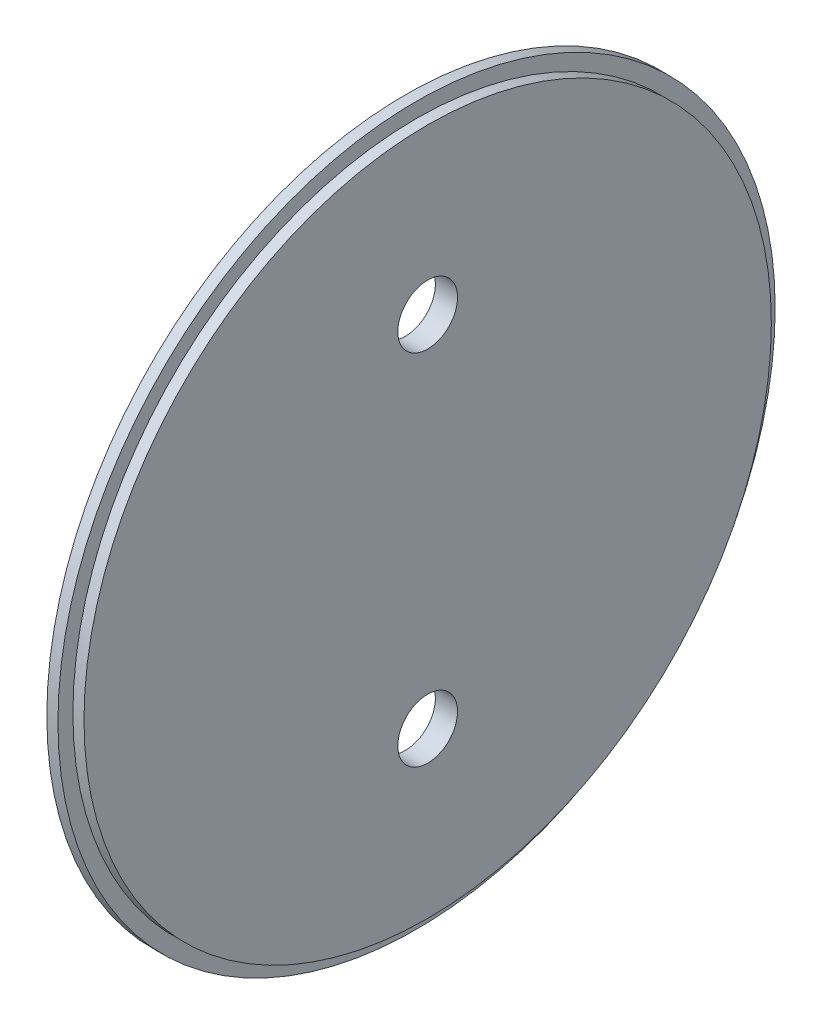
ISO-10303-21;
HEADER;
FILE_DESCRIPTION(('STEP AP214'),'2;1');
FILE_NAME('part.step','',(''),(''),'','','');
FILE_SCHEMA(('AUTOMOTIVE_DESIGN { 1 0 10303 214 1 1 1 1 }'));
ENDSEC;
DATA;
#1=APPLICATION_CONTEXT('core data for automotive mechanical design processes');
#2=APPLICATION_PROTOCOL_DEFINITION('international standard','automotive_design',2000,#1);
#3=PRODUCT_CONTEXT('',#1,'mechanical');
#4=PRODUCT('Part','Part','',(#3));
#5=PRODUCT_RELATED_PRODUCT_CATEGORY('part','',(#4));
#6=PRODUCT_DEFINITION_FORMATION('','',#4);
#7=PRODUCT_DEFINITION_CONTEXT('part definition',#1,'design');
#8=PRODUCT_DEFINITION('design','',#6,#7);
#9=PRODUCT_DEFINITION_SHAPE('','',#8);
#10=(LENGTH_UNIT() NAMED_UNIT(*) SI_UNIT(.MILLI.,.METRE.));
#11=(NAMED_UNIT(*) PLANE_ANGLE_UNIT() SI_UNIT($,.RADIAN.));
#12=(NAMED_UNIT(*) SI_UNIT($,.STERADIAN.) SOLID_ANGLE_UNIT());
#13=UNCERTAINTY_MEASURE_WITH_UNIT(LENGTH_MEASURE(1.E-05),#10,'distance_accuracy_value','');
#14=(GEOMETRIC_REPRESENTATION_CONTEXT(3) GLOBAL_UNCERTAINTY_ASSIGNED_CONTEXT((#13)) GLOBAL_UNIT_ASSIGNED_CONTEXT((#10,
#11,#12)) REPRESENTATION_CONTEXT('',''));
#15=CARTESIAN_POINT('',(0.,0.,0.));
#16=DIRECTION('',(0.,0.,1.));
#17=DIRECTION('',(1.,0.,0.));
#18=AXIS2_PLACEMENT_3D('',#15,#16,#17);
#19=CARTESIAN_POINT('',(1.1811,0.,0.));
#20=DIRECTION('',(-1.,0.,0.));
#21=DIRECTION('',(0.,0.,1.));
#22=AXIS2_PLACEMENT_3D('',#19,#20,#21);
#23=CYLINDRICAL_SURFACE('',#22,38.1);
#24=CARTESIAN_POINT('',(1.1811,0.,0.));
#25=DIRECTION('',(1.,0.,0.));
#26=DIRECTION('',(0.,0.,-1.));
#27=AXIS2_PLACEMENT_3D('',#24,#25,#26);
#28=CIRCLE('',#27,38.1);
#29=CARTESIAN_POINT('',(1.1811,0.,-38.1));
#30=VERTEX_POINT('',#29);
#31=EDGE_CURVE('E50',#30,#30,#28,.T.);
#32=ORIENTED_EDGE('',*,*,#31,.F.);
#33=EDGE_LOOP('',(#32));
#34=FACE_BOUND('',#33,.T.);
#35=CARTESIAN_POINT('',(0.,0.,0.));
#36=DIRECTION('',(1.,0.,0.));
#37=DIRECTION('',(0.,0.,-1.));
#38=AXIS2_PLACEMENT_3D('',#35,#36,#37);
#39=CIRCLE('',#38,38.1);
#40=CARTESIAN_POINT('',(0.,0.,-38.1));
#41=VERTEX_POINT('',#40);
#42=EDGE_CURVE('E45',#41,#41,#39,.T.);
#43=ORIENTED_EDGE('',*,*,#42,.T.);
#44=EDGE_LOOP('',(#43));
#45=FACE_BOUND('',#44,.T.);
#46=ADVANCED_FACE('F42',(#34,#45),#23,.T.);
#47=CARTESIAN_POINT('',(1.1811,0.,0.));
#48=DIRECTION('',(1.,0.,0.));
#49=DIRECTION('',(0.,0.,-1.));
#50=AXIS2_PLACEMENT_3D('',#47,#48,#49);
#51=PLANE('',#50);
#52=CARTESIAN_POINT('',(1.1811,0.,0.));
#53=DIRECTION('',(1.,0.,0.));
#54=DIRECTION('',(0.,0.,-1.));
#55=AXIS2_PLACEMENT_3D('',#52,#53,#54);
#56=CIRCLE('',#55,36.5125);
#57=CARTESIAN_POINT('',(1.1811,0.,-36.5125));
#58=VERTEX_POINT('',#57);
#59=EDGE_CURVE('E10',#58,#58,#56,.T.);
#60=ORIENTED_EDGE('',*,*,#59,.F.);
#61=EDGE_LOOP('',(#60));
#62=FACE_BOUND('',#61,.T.);
#63=ORIENTED_EDGE('',*,*,#31,.T.);
#64=EDGE_LOOP('',(#63));
#65=FACE_BOUND('',#64,.T.);
#66=ADVANCED_FACE('F92',(#62,#65),#51,.T.);
#67=CARTESIAN_POINT('',(0.,0.,0.));
#68=DIRECTION('',(1.,0.,0.));
#69=DIRECTION('',(0.,0.,-1.));
#70=AXIS2_PLACEMENT_3D('',#67,#68,#69);
#71=PLANE('',#70);
#72=CARTESIAN_POINT('',(0.,-19.05,0.));
#73=DIRECTION('',(-1.,0.,0.));
#74=DIRECTION('',(0.,0.,1.));
#75=AXIS2_PLACEMENT_3D('',#72,#73,#74);
#76=CIRCLE('',#75,3.175);
#77=CARTESIAN_POINT('',(0.,-19.05,3.175));
#78=VERTEX_POINT('',#77);
#79=EDGE_CURVE('E70',#78,#78,#76,.T.);
#80=ORIENTED_EDGE('',*,*,#79,.F.);
#81=EDGE_LOOP('',(#80));
#82=FACE_BOUND('',#81,.T.);
#83=CARTESIAN_POINT('',(0.,19.05,0.));
#84=DIRECTION('',(-1.,0.,0.));
#85=DIRECTION('',(0.,0.,1.));
#86=AXIS2_PLACEMENT_3D('',#83,#84,#85);
#87=CIRCLE('',#86,3.17500000000001);
#88=CARTESIAN_POINT('',(0.,19.05,3.17500000000001));
#89=VERTEX_POINT('',#88);
#90=EDGE_CURVE('E66',#89,#89,#87,.T.);
#91=ORIENTED_EDGE('',*,*,#90,.F.);
#92=EDGE_LOOP('',(#91));
#93=FACE_BOUND('',#92,.T.);
#94=ORIENTED_EDGE('',*,*,#42,.F.);
#95=EDGE_LOOP('',(#94));
#96=FACE_BOUND('',#95,.T.);
#97=ADVANCED_FACE('F88',(#82,#93,#96),#71,.F.);
#98=CARTESIAN_POINT('',(2.3622,0.,0.));
#99=DIRECTION('',(-1.,0.,0.));
#100=DIRECTION('',(0.,0.,1.));
#101=AXIS2_PLACEMENT_3D('',#98,#99,#100);
#102=CYLINDRICAL_SURFACE('',#101,36.5125);
#103=CARTESIAN_POINT('',(2.3622,0.,0.));
#104=DIRECTION('',(1.,0.,0.));
#105=DIRECTION('',(0.,0.,-1.));
#106=AXIS2_PLACEMENT_3D('',#103,#104,#105);
#107=CIRCLE('',#106,36.5125);
#108=CARTESIAN_POINT('',(2.3622,0.,-36.5125));
#109=VERTEX_POINT('',#108);
#110=EDGE_CURVE('E57',#109,#109,#107,.T.);
#111=ORIENTED_EDGE('',*,*,#110,.F.);
#112=EDGE_LOOP('',(#111));
#113=FACE_BOUND('',#112,.T.);
#114=ORIENTED_EDGE('',*,*,#59,.T.);
#115=EDGE_LOOP('',(#114));
#116=FACE_BOUND('',#115,.T.);
#117=ADVANCED_FACE('F91',(#113,#116),#102,.T.);
#118=CARTESIAN_POINT('',(2.3622,0.,0.));
#119=DIRECTION('',(1.,0.,0.));
#120=DIRECTION('',(0.,0.,-1.));
#121=AXIS2_PLACEMENT_3D('',#118,#119,#120);
#122=PLANE('',#121);
#123=CARTESIAN_POINT('',(2.3622,-19.05,0.));
#124=DIRECTION('',(-1.,0.,0.));
#125=DIRECTION('',(0.,0.,1.));
#126=AXIS2_PLACEMENT_3D('',#123,#124,#125);
#127=CIRCLE('',#126,3.175);
#128=CARTESIAN_POINT('',(2.3622,-19.05,3.175));
#129=VERTEX_POINT('',#128);
#130=EDGE_CURVE('E61',#129,#129,#127,.T.);
#131=ORIENTED_EDGE('',*,*,#130,.T.);
#132=EDGE_LOOP('',(#131));
#133=FACE_BOUND('',#132,.T.);
#134=CARTESIAN_POINT('',(2.3622,19.05,0.));
#135=DIRECTION('',(-1.,0.,0.));
#136=DIRECTION('',(0.,0.,1.));
#137=AXIS2_PLACEMENT_3D('',#134,#135,#136);
#138=CIRCLE('',#137,3.17500000000001);
#139=CARTESIAN_POINT('',(2.3622,19.05,3.17500000000001));
#140=VERTEX_POINT('',#139);
#141=EDGE_CURVE('E62',#140,#140,#138,.T.);
#142=ORIENTED_EDGE('',*,*,#141,.T.);
#143=EDGE_LOOP('',(#142));
#144=FACE_BOUND('',#143,.T.);
#145=ORIENTED_EDGE('',*,*,#110,.T.);
#146=EDGE_LOOP('',(#145));
#147=FACE_BOUND('',#146,.T.);
#148=ADVANCED_FACE('F78',(#133,#144,#147),#122,.T.);
#149=CARTESIAN_POINT('',(2.3622,19.05,0.));
#150=DIRECTION('',(-1.,0.,0.));
#151=DIRECTION('',(0.,0.,1.));
#152=AXIS2_PLACEMENT_3D('',#149,#150,#151);
#153=CYLINDRICAL_SURFACE('',#152,3.17500000000001);
#154=ORIENTED_EDGE('',*,*,#141,.F.);
#155=EDGE_LOOP('',(#154));
#156=FACE_BOUND('',#155,.T.);
#157=ORIENTED_EDGE('',*,*,#90,.T.);
#158=EDGE_LOOP('',(#157));
#159=FACE_BOUND('',#158,.T.);
#160=ADVANCED_FACE('F84',(#156,#159),#153,.F.);
#161=CARTESIAN_POINT('',(2.3622,-19.05,0.));
#162=DIRECTION('',(-1.,0.,0.));
#163=DIRECTION('',(0.,0.,1.));
#164=AXIS2_PLACEMENT_3D('',#161,#162,#163);
#165=CYLINDRICAL_SURFACE('',#164,3.175);
#166=ORIENTED_EDGE('',*,*,#130,.F.);
#167=EDGE_LOOP('',(#166));
#168=FACE_BOUND('',#167,.T.);
#169=ORIENTED_EDGE('',*,*,#79,.T.);
#170=EDGE_LOOP('',(#169));
#171=FACE_BOUND('',#170,.T.);
#172=ADVANCED_FACE('F81',(#168,#171),#165,.F.);
#173=CLOSED_SHELL('',(#46,#66,#97,#117,#148,#160,#172));
#174=MANIFOLD_SOLID_BREP('B2',#173);
#175=ADVANCED_BREP_SHAPE_REPRESENTATION('',(#18,#174),#14);
#176=SHAPE_DEFINITION_REPRESENTATION(#9,#175);
ENDSEC;
END-ISO-10303-21;
